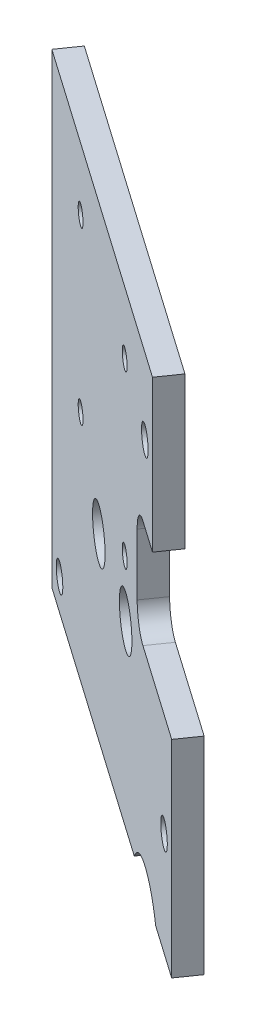
ISO-10303-21;
HEADER;
FILE_DESCRIPTION(('STEP AP214'),'2;1');
FILE_NAME('part.step','',(''),(''),'','','');
FILE_SCHEMA(('AUTOMOTIVE_DESIGN { 1 0 10303 214 1 1 1 1 }'));
ENDSEC;
DATA;
#1=APPLICATION_CONTEXT('core data for automotive mechanical design processes');
#2=APPLICATION_PROTOCOL_DEFINITION('international standard','automotive_design',2000,#1);
#3=PRODUCT_CONTEXT('',#1,'mechanical');
#4=PRODUCT('Part','Part','',(#3));
#5=PRODUCT_RELATED_PRODUCT_CATEGORY('part','',(#4));
#6=PRODUCT_DEFINITION_FORMATION('','',#4);
#7=PRODUCT_DEFINITION_CONTEXT('part definition',#1,'design');
#8=PRODUCT_DEFINITION('design','',#6,#7);
#9=PRODUCT_DEFINITION_SHAPE('','',#8);
#10=(LENGTH_UNIT() NAMED_UNIT(*) SI_UNIT(.MILLI.,.METRE.));
#11=(NAMED_UNIT(*) PLANE_ANGLE_UNIT() SI_UNIT($,.RADIAN.));
#12=(NAMED_UNIT(*) SI_UNIT($,.STERADIAN.) SOLID_ANGLE_UNIT());
#13=UNCERTAINTY_MEASURE_WITH_UNIT(LENGTH_MEASURE(1.E-05),#10,'distance_accuracy_value','');
#14=(GEOMETRIC_REPRESENTATION_CONTEXT(3) GLOBAL_UNCERTAINTY_ASSIGNED_CONTEXT((#13)) GLOBAL_UNIT_ASSIGNED_CONTEXT((#10,
#11,#12)) REPRESENTATION_CONTEXT('',''));
#15=CARTESIAN_POINT('',(0.,0.,0.));
#16=DIRECTION('',(0.,0.,1.));
#17=DIRECTION('',(1.,0.,0.));
#18=AXIS2_PLACEMENT_3D('',#15,#16,#17);
#19=CARTESIAN_POINT('',(1.01290984994584,263.511550751504,-34.4288985364269));
#20=DIRECTION('',(0.572880015701416,0.,-0.819639242356017));
#21=DIRECTION('',(-0.819639242356017,0.,-0.572880015701416));
#22=AXIS2_PLACEMENT_3D('',#19,#20,#21);
#23=PLANE('',#22);
#24=CARTESIAN_POINT('',(1.83254909230199,276.261550751504,-33.8560185207254));
#25=DIRECTION('',(0.572880015701416,0.,-0.819639242356017));
#26=DIRECTION('',(-0.819639242356017,0.,-0.572880015701416));
#27=AXIS2_PLACEMENT_3D('',#24,#25,#26);
#28=CIRCLE('',#27,3.46999999999997);
#29=CARTESIAN_POINT('',(-1.01159907867336,276.261550751504,-35.8439121752093));
#30=VERTEX_POINT('',#29);
#31=EDGE_CURVE('E317',#30,#30,#28,.T.);
#32=ORIENTED_EDGE('',*,*,#31,.F.);
#33=EDGE_LOOP('',(#32));
#34=FACE_BOUND('',#33,.T.);
#35=CARTESIAN_POINT('',(10.0405401142264,239.311550751504,-28.1191116200737));
#36=DIRECTION('',(0.572880015701416,0.,-0.819639242356017));
#37=DIRECTION('',(-0.819639242356017,0.,-0.572880015701416));
#38=AXIS2_PLACEMENT_3D('',#35,#36,#37);
#39=CIRCLE('',#38,3.47);
#40=CARTESIAN_POINT('',(7.19639194325104,239.311550751504,-30.1070052745576));
#41=VERTEX_POINT('',#40);
#42=EDGE_CURVE('E324',#41,#41,#39,.T.);
#43=ORIENTED_EDGE('',*,*,#42,.F.);
#44=EDGE_LOOP('',(#43));
#45=FACE_BOUND('',#44,.T.);
#46=CARTESIAN_POINT('',(-34.6413971925408,230.011550751504,-59.3491792194384));
#47=DIRECTION('',(0.572880015701416,0.,-0.819639242356017));
#48=DIRECTION('',(-0.819639242356017,0.,-0.572880015701416));
#49=AXIS2_PLACEMENT_3D('',#46,#47,#48);
#50=CIRCLE('',#49,3.47);
#51=CARTESIAN_POINT('',(-37.4855453635161,230.011550751504,-61.3370728739223));
#52=VERTEX_POINT('',#51);
#53=EDGE_CURVE('E333',#52,#52,#50,.T.);
#54=ORIENTED_EDGE('',*,*,#53,.F.);
#55=EDGE_LOOP('',(#54));
#56=FACE_BOUND('',#55,.T.);
#57=CARTESIAN_POINT('',(-25.6253655266247,278.011550751504,-53.0474990467229));
#58=DIRECTION('',(0.572880015701416,0.,-0.819639242356017));
#59=DIRECTION('',(-0.819639242356017,0.,-0.572880015701416));
#60=AXIS2_PLACEMENT_3D('',#57,#58,#59);
#61=CIRCLE('',#60,1.25);
#62=CARTESIAN_POINT('',(-26.6499145795698,278.011550751504,-53.7635990663497));
#63=VERTEX_POINT('',#62);
#64=EDGE_CURVE('E353',#63,#63,#61,.T.);
#65=ORIENTED_EDGE('',*,*,#64,.F.);
#66=EDGE_LOOP('',(#65));
#67=FACE_BOUND('',#66,.T.);
#68=CARTESIAN_POINT('',(-6.77366295243632,256.011550751504,-39.8712586855903));
#69=DIRECTION('',(0.572880015701416,0.,-0.819639242356017));
#70=DIRECTION('',(-0.819639242356017,0.,-0.572880015701416));
#71=AXIS2_PLACEMENT_3D('',#68,#69,#70);
#72=CIRCLE('',#71,1.25);
#73=CARTESIAN_POINT('',(-7.79821200538134,256.011550751504,-40.5873587052171));
#74=VERTEX_POINT('',#73);
#75=EDGE_CURVE('E346',#74,#74,#72,.T.);
#76=ORIENTED_EDGE('',*,*,#75,.F.);
#77=EDGE_LOOP('',(#76));
#78=FACE_BOUND('',#77,.T.);
#79=CARTESIAN_POINT('',(-25.6253655266247,256.011550751504,-53.0474990467229));
#80=DIRECTION('',(0.572880015701416,0.,-0.819639242356017));
#81=DIRECTION('',(-0.819639242356017,0.,-0.572880015701416));
#82=AXIS2_PLACEMENT_3D('',#79,#80,#81);
#83=CIRCLE('',#82,1.25);
#84=CARTESIAN_POINT('',(-26.6499145795698,256.011550751504,-53.7635990663497));
#85=VERTEX_POINT('',#84);
#86=EDGE_CURVE('E342',#85,#85,#83,.T.);
#87=ORIENTED_EDGE('',*,*,#86,.F.);
#88=EDGE_LOOP('',(#87));
#89=FACE_BOUND('',#88,.T.);
#90=CARTESIAN_POINT('',(-6.77366295243633,278.011550751504,-39.8712586855903));
#91=DIRECTION('',(0.572880015701416,0.,-0.819639242356017));
#92=DIRECTION('',(-0.819639242356017,0.,-0.572880015701416));
#93=AXIS2_PLACEMENT_3D('',#90,#91,#92);
#94=CIRCLE('',#93,1.25);
#95=CARTESIAN_POINT('',(-7.79821200538135,278.011550751504,-40.5873587052171));
#96=VERTEX_POINT('',#95);
#97=EDGE_CURVE('E352',#96,#96,#94,.T.);
#98=ORIENTED_EDGE('',*,*,#97,.F.);
#99=EDGE_LOOP('',(#98));
#100=FACE_BOUND('',#99,.T.);
#101=CARTESIAN_POINT('',(-6.36384333125833,249.061550751504,-39.5848186777396));
#102=DIRECTION('',(0.572880015701416,0.,-0.819639242356017));
#103=DIRECTION('',(-0.819639242356017,0.,-0.572880015701416));
#104=AXIS2_PLACEMENT_3D('',#101,#102,#103);
#105=CIRCLE('',#104,3.24999999999999);
#106=CARTESIAN_POINT('',(-9.02767086891538,249.061550751504,-41.4466787287692));
#107=VERTEX_POINT('',#106);
#108=EDGE_CURVE('E158',#107,#107,#105,.T.);
#109=ORIENTED_EDGE('',*,*,#108,.F.);
#110=EDGE_LOOP('',(#109));
#111=FACE_BOUND('',#110,.T.);
#112=DIRECTION('',(0.,-1.,0.));
#113=VECTOR('',#112,1.);
#114=CARTESIAN_POINT('',(5.11110606172592,286.011550751504,-31.5644984579198));
#115=LINE('',#114,#113);
#116=CARTESIAN_POINT('',(5.11110606172592,286.011550751504,-31.5644984579198));
#117=VERTEX_POINT('',#116);
#118=CARTESIAN_POINT('',(5.11110606172593,266.511550751504,-31.5644984579198));
#119=VERTEX_POINT('',#118);
#120=EDGE_CURVE('E177',#117,#119,#115,.T.);
#121=ORIENTED_EDGE('',*,*,#120,.T.);
#122=DIRECTION('',(-0.819639242356017,0.,-0.572880015701416));
#123=VECTOR('',#122,1.);
#124=CARTESIAN_POINT('',(5.11110606172593,266.511550751504,-31.5644984579198));
#125=LINE('',#124,#123);
#126=CARTESIAN_POINT('',(1.01290984994584,266.511550751504,-34.4288985364269));
#127=VERTEX_POINT('',#126);
#128=EDGE_CURVE('E105',#119,#127,#125,.T.);
#129=ORIENTED_EDGE('',*,*,#128,.T.);
#130=CARTESIAN_POINT('',(1.01290984994584,263.511550751504,-34.4288985364269));
#131=DIRECTION('',(-0.572880015701416,0.,0.819639242356017));
#132=DIRECTION('',(-0.819639242356017,0.,-0.572880015701416));
#133=AXIS2_PLACEMENT_3D('',#130,#131,#132);
#134=CIRCLE('',#133,3.);
#135=CARTESIAN_POINT('',(-1.4460078771222,263.511550751504,-36.1475385835311));
#136=VERTEX_POINT('',#135);
#137=EDGE_CURVE('E204',#127,#136,#134,.T.);
#138=ORIENTED_EDGE('',*,*,#137,.T.);
#139=DIRECTION('',(0.,-1.,0.));
#140=VECTOR('',#139,1.);
#141=CARTESIAN_POINT('',(-1.4460078771222,255.611550751504,-36.1475385835311));
#142=LINE('',#141,#140);
#143=CARTESIAN_POINT('',(-1.4460078771222,255.611550751504,-36.1475385835311));
#144=VERTEX_POINT('',#143);
#145=EDGE_CURVE('E223',#136,#144,#142,.T.);
#146=ORIENTED_EDGE('',*,*,#145,.T.);
#147=CARTESIAN_POINT('',(1.01290984994585,255.611550751504,-34.4288985364269));
#148=DIRECTION('',(-0.572880015701416,0.,0.819639242356017));
#149=DIRECTION('',(-0.819639242356017,0.,-0.572880015701416));
#150=AXIS2_PLACEMENT_3D('',#147,#148,#149);
#151=CIRCLE('',#150,3.);
#152=CARTESIAN_POINT('',(1.01290984994586,252.611550751504,-34.4288985364269));
#153=VERTEX_POINT('',#152);
#154=EDGE_CURVE('E220',#144,#153,#151,.T.);
#155=ORIENTED_EDGE('',*,*,#154,.T.);
#156=DIRECTION('',(0.819639242356017,0.,0.572880015701416));
#157=VECTOR('',#156,1.);
#158=CARTESIAN_POINT('',(13.3190970836504,252.611550751504,-25.8275915572681));
#159=LINE('',#158,#157);
#160=CARTESIAN_POINT('',(13.3190970836504,252.611550751504,-25.8275915572681));
#161=VERTEX_POINT('',#160);
#162=EDGE_CURVE('E222',#153,#161,#159,.T.);
#163=ORIENTED_EDGE('',*,*,#162,.T.);
#164=DIRECTION('',(0.,-1.,0.));
#165=VECTOR('',#164,1.);
#166=CARTESIAN_POINT('',(13.3190970836504,226.011550751504,-25.8275915572681));
#167=LINE('',#166,#165);
#168=CARTESIAN_POINT('',(13.3190970836504,226.011550751504,-25.8275915572681));
#169=VERTEX_POINT('',#168);
#170=EDGE_CURVE('E225',#161,#169,#167,.T.);
#171=ORIENTED_EDGE('',*,*,#170,.T.);
#172=DIRECTION('',(-0.819639242356017,0.,-0.572880015701416));
#173=VECTOR('',#172,1.);
#174=CARTESIAN_POINT('',(6.49000061143768,226.011550751504,-30.6007316072517));
#175=LINE('',#174,#173);
#176=CARTESIAN_POINT('',(6.49000061143768,226.011550751504,-30.6007316072517));
#177=VERTEX_POINT('',#176);
#178=EDGE_CURVE('E231',#169,#177,#175,.T.);
#179=ORIENTED_EDGE('',*,*,#178,.T.);
#180=CARTESIAN_POINT('',(1.90545868348782,221.802726425216,-33.8050589697609));
#181=DIRECTION('',(-0.572880015701416,0.,0.819639242356017));
#182=DIRECTION('',(-0.819639242356017,0.,-0.572880015701416));
#183=AXIS2_PLACEMENT_3D('',#180,#181,#182);
#184=CIRCLE('',#183,6.99999576748517);
#185=CARTESIAN_POINT('',(-2.67908324446203,226.011550751504,-37.0093863322701));
#186=VERTEX_POINT('',#185);
#187=EDGE_CURVE('E136',#177,#186,#184,.T.);
#188=ORIENTED_EDGE('',*,*,#187,.T.);
#189=DIRECTION('',(-0.819639242356017,0.,-0.572880015701416));
#190=VECTOR('',#189,1.);
#191=CARTESIAN_POINT('',(-2.67908324446203,226.011550751504,-37.0093863322701));
#192=LINE('',#191,#190);
#193=CARTESIAN_POINT('',(-37.9199541619649,226.011550751504,-61.6406992822442));
#194=VERTEX_POINT('',#193);
#195=EDGE_CURVE('E130',#186,#194,#192,.T.);
#196=ORIENTED_EDGE('',*,*,#195,.T.);
#197=DIRECTION('',(0.,1.,0.));
#198=VECTOR('',#197,1.);
#199=CARTESIAN_POINT('',(-37.919954161965,286.011550751504,-61.6406992822442));
#200=LINE('',#199,#198);
#201=CARTESIAN_POINT('',(-37.919954161965,286.011550751504,-61.6406992822442));
#202=VERTEX_POINT('',#201);
#203=EDGE_CURVE('E134',#194,#202,#200,.T.);
#204=ORIENTED_EDGE('',*,*,#203,.T.);
#205=DIRECTION('',(0.819639242356017,0.,0.572880015701416));
#206=VECTOR('',#205,1.);
#207=CARTESIAN_POINT('',(5.11110606172592,286.011550751504,-31.5644984579198));
#208=LINE('',#207,#206);
#209=EDGE_CURVE('E50',#202,#117,#208,.T.);
#210=ORIENTED_EDGE('',*,*,#209,.T.);
#211=EDGE_LOOP('',(#121,#129,#138,#146,#155,#163,#171,#179,#188,#196,#204,#210));
#212=FACE_BOUND('',#211,.T.);
#213=CARTESIAN_POINT('',(-17.8387927242426,249.061550751504,-47.6051388975595));
#214=DIRECTION('',(0.572880015701416,0.,-0.819639242356017));
#215=DIRECTION('',(-0.819639242356017,0.,-0.572880015701416));
#216=AXIS2_PLACEMENT_3D('',#213,#214,#215);
#217=CIRCLE('',#216,3.25000000000001);
#218=CARTESIAN_POINT('',(-20.5026202618996,249.061550751504,-49.4669989485891));
#219=VERTEX_POINT('',#218);
#220=EDGE_CURVE('E367',#219,#219,#217,.T.);
#221=ORIENTED_EDGE('',*,*,#220,.F.);
#222=EDGE_LOOP('',(#221));
#223=FACE_BOUND('',#222,.T.);
#224=ADVANCED_FACE('F33',(#34,#45,#56,#67,#78,#89,#100,#111,#212,#223),#23,.T.);
#225=CARTESIAN_POINT('',(-0.705730197158404,263.511550751504,-31.9699808093588));
#226=DIRECTION('',(0.572880015701416,0.,-0.819639242356017));
#227=DIRECTION('',(-0.819639242356017,0.,-0.572880015701416));
#228=AXIS2_PLACEMENT_3D('',#225,#226,#227);
#229=PLANE('',#228);
#230=CARTESIAN_POINT('',(0.11390904519774,276.261550751504,-31.3971007936573));
#231=DIRECTION('',(0.572880015701416,0.,-0.819639242356017));
#232=DIRECTION('',(-0.819639242356017,0.,-0.572880015701416));
#233=AXIS2_PLACEMENT_3D('',#230,#231,#232);
#234=CIRCLE('',#233,1.69999999999998);
#235=CARTESIAN_POINT('',(-1.27947766680747,276.261550751504,-32.3709968203497));
#236=VERTEX_POINT('',#235);
#237=EDGE_CURVE('E319',#236,#236,#234,.T.);
#238=ORIENTED_EDGE('',*,*,#237,.T.);
#239=EDGE_LOOP('',(#238));
#240=FACE_BOUND('',#239,.T.);
#241=CARTESIAN_POINT('',(8.32190006712217,239.311550751504,-25.6601938930057));
#242=DIRECTION('',(0.572880015701416,0.,-0.819639242356017));
#243=DIRECTION('',(-0.819639242356017,0.,-0.572880015701416));
#244=AXIS2_PLACEMENT_3D('',#241,#242,#243);
#245=CIRCLE('',#244,1.69999999999998);
#246=CARTESIAN_POINT('',(6.92851335511696,239.311550751504,-26.6340899196981));
#247=VERTEX_POINT('',#246);
#248=EDGE_CURVE('E330',#247,#247,#245,.T.);
#249=ORIENTED_EDGE('',*,*,#248,.T.);
#250=EDGE_LOOP('',(#249));
#251=FACE_BOUND('',#250,.T.);
#252=CARTESIAN_POINT('',(-36.360037239645,230.011550751504,-56.8902614923704));
#253=DIRECTION('',(0.572880015701416,0.,-0.819639242356017));
#254=DIRECTION('',(-0.819639242356017,0.,-0.572880015701416));
#255=AXIS2_PLACEMENT_3D('',#252,#253,#254);
#256=CIRCLE('',#255,1.69999999999998);
#257=CARTESIAN_POINT('',(-37.7534239516502,230.011550751504,-57.8641575190628));
#258=VERTEX_POINT('',#257);
#259=EDGE_CURVE('E339',#258,#258,#256,.T.);
#260=ORIENTED_EDGE('',*,*,#259,.T.);
#261=EDGE_LOOP('',(#260));
#262=FACE_BOUND('',#261,.T.);
#263=CARTESIAN_POINT('',(-27.344005573729,278.011550751504,-50.5885813196549));
#264=DIRECTION('',(0.572880015701416,0.,-0.819639242356017));
#265=DIRECTION('',(-0.819639242356017,0.,-0.572880015701416));
#266=AXIS2_PLACEMENT_3D('',#263,#264,#265);
#267=CIRCLE('',#266,1.25);
#268=CARTESIAN_POINT('',(-28.368554626674,278.011550751504,-51.3046813392817));
#269=VERTEX_POINT('',#268);
#270=EDGE_CURVE('E349',#269,#269,#267,.T.);
#271=ORIENTED_EDGE('',*,*,#270,.T.);
#272=EDGE_LOOP('',(#271));
#273=FACE_BOUND('',#272,.T.);
#274=CARTESIAN_POINT('',(-8.49230299954056,256.011550751504,-37.4123409585223));
#275=DIRECTION('',(0.572880015701416,0.,-0.819639242356017));
#276=DIRECTION('',(-0.819639242356017,0.,-0.572880015701416));
#277=AXIS2_PLACEMENT_3D('',#274,#275,#276);
#278=CIRCLE('',#277,1.25);
#279=CARTESIAN_POINT('',(-9.51685205248559,256.011550751504,-38.1284409781491));
#280=VERTEX_POINT('',#279);
#281=EDGE_CURVE('E356',#280,#280,#278,.T.);
#282=ORIENTED_EDGE('',*,*,#281,.T.);
#283=EDGE_LOOP('',(#282));
#284=FACE_BOUND('',#283,.T.);
#285=CARTESIAN_POINT('',(-27.344005573729,256.011550751504,-50.5885813196549));
#286=DIRECTION('',(0.572880015701416,0.,-0.819639242356017));
#287=DIRECTION('',(-0.819639242356017,0.,-0.572880015701416));
#288=AXIS2_PLACEMENT_3D('',#285,#286,#287);
#289=CIRCLE('',#288,1.25);
#290=CARTESIAN_POINT('',(-28.368554626674,256.011550751504,-51.3046813392817));
#291=VERTEX_POINT('',#290);
#292=EDGE_CURVE('E343',#291,#291,#289,.T.);
#293=ORIENTED_EDGE('',*,*,#292,.T.);
#294=EDGE_LOOP('',(#293));
#295=FACE_BOUND('',#294,.T.);
#296=CARTESIAN_POINT('',(-8.49230299954058,278.011550751504,-37.4123409585223));
#297=DIRECTION('',(0.572880015701416,0.,-0.819639242356017));
#298=DIRECTION('',(-0.819639242356017,0.,-0.572880015701416));
#299=AXIS2_PLACEMENT_3D('',#296,#297,#298);
#300=CIRCLE('',#299,1.25);
#301=CARTESIAN_POINT('',(-9.5168520524856,278.011550751504,-38.1284409781491));
#302=VERTEX_POINT('',#301);
#303=EDGE_CURVE('E361',#302,#302,#300,.T.);
#304=ORIENTED_EDGE('',*,*,#303,.T.);
#305=EDGE_LOOP('',(#304));
#306=FACE_BOUND('',#305,.T.);
#307=DIRECTION('',(0.,-1.,0.));
#308=VECTOR('',#307,1.);
#309=CARTESIAN_POINT('',(3.39246601462168,286.011550751504,-29.1055807308518));
#310=LINE('',#309,#308);
#311=CARTESIAN_POINT('',(3.39246601462168,286.011550751504,-29.1055807308518));
#312=VERTEX_POINT('',#311);
#313=CARTESIAN_POINT('',(3.39246601462168,266.511550751504,-29.1055807308518));
#314=VERTEX_POINT('',#313);
#315=EDGE_CURVE('E154',#312,#314,#310,.T.);
#316=ORIENTED_EDGE('',*,*,#315,.F.);
#317=DIRECTION('',(0.819639242356017,0.,0.572880015701416));
#318=VECTOR('',#317,1.);
#319=CARTESIAN_POINT('',(3.39246601462168,286.011550751504,-29.1055807308518));
#320=LINE('',#319,#318);
#321=CARTESIAN_POINT('',(-39.6385942090692,286.011550751504,-59.1817815551761));
#322=VERTEX_POINT('',#321);
#323=EDGE_CURVE('E97',#322,#312,#320,.T.);
#324=ORIENTED_EDGE('',*,*,#323,.F.);
#325=DIRECTION('',(0.,1.,0.));
#326=VECTOR('',#325,1.);
#327=CARTESIAN_POINT('',(-39.6385942090692,286.011550751504,-59.1817815551761));
#328=LINE('',#327,#326);
#329=CARTESIAN_POINT('',(-39.6385942090692,226.011550751504,-59.1817815551761));
#330=VERTEX_POINT('',#329);
#331=EDGE_CURVE('E91',#330,#322,#328,.T.);
#332=ORIENTED_EDGE('',*,*,#331,.F.);
#333=DIRECTION('',(-0.819639242356017,0.,-0.572880015701416));
#334=VECTOR('',#333,1.);
#335=CARTESIAN_POINT('',(-4.39772329156628,226.011550751504,-34.5504686052021));
#336=LINE('',#335,#334);
#337=CARTESIAN_POINT('',(-4.39772329156628,226.011550751504,-34.5504686052021));
#338=VERTEX_POINT('',#337);
#339=EDGE_CURVE('E144',#338,#330,#336,.T.);
#340=ORIENTED_EDGE('',*,*,#339,.F.);
#341=CARTESIAN_POINT('',(0.186818636383576,221.802726425216,-31.3461412426929));
#342=DIRECTION('',(-0.572880015701416,0.,0.819639242356017));
#343=DIRECTION('',(-0.819639242356017,0.,-0.572880015701416));
#344=AXIS2_PLACEMENT_3D('',#341,#342,#343);
#345=CIRCLE('',#344,6.99999576748517);
#346=CARTESIAN_POINT('',(4.77136056433343,226.011550751504,-28.1418138801837));
#347=VERTEX_POINT('',#346);
#348=EDGE_CURVE('E172',#347,#338,#345,.T.);
#349=ORIENTED_EDGE('',*,*,#348,.F.);
#350=DIRECTION('',(-0.819639242356017,0.,-0.572880015701416));
#351=VECTOR('',#350,1.);
#352=CARTESIAN_POINT('',(4.77136056433343,226.011550751504,-28.1418138801837));
#353=LINE('',#352,#351);
#354=CARTESIAN_POINT('',(11.6004570365461,226.011550751504,-23.3686738302001));
#355=VERTEX_POINT('',#354);
#356=EDGE_CURVE('E170',#355,#347,#353,.T.);
#357=ORIENTED_EDGE('',*,*,#356,.F.);
#358=DIRECTION('',(0.,-1.,0.));
#359=VECTOR('',#358,1.);
#360=CARTESIAN_POINT('',(11.6004570365461,226.011550751504,-23.3686738302001));
#361=LINE('',#360,#359);
#362=CARTESIAN_POINT('',(11.6004570365461,252.611550751504,-23.3686738302001));
#363=VERTEX_POINT('',#362);
#364=EDGE_CURVE('E168',#363,#355,#361,.T.);
#365=ORIENTED_EDGE('',*,*,#364,.F.);
#366=DIRECTION('',(0.819639242356017,0.,0.572880015701416));
#367=VECTOR('',#366,1.);
#368=CARTESIAN_POINT('',(11.6004570365461,252.611550751504,-23.3686738302001));
#369=LINE('',#368,#367);
#370=CARTESIAN_POINT('',(-0.705730197158392,252.611550751504,-31.9699808093588));
#371=VERTEX_POINT('',#370);
#372=EDGE_CURVE('E166',#371,#363,#369,.T.);
#373=ORIENTED_EDGE('',*,*,#372,.F.);
#374=CARTESIAN_POINT('',(-0.705730197158394,255.611550751504,-31.9699808093588));
#375=DIRECTION('',(-0.572880015701416,0.,0.819639242356017));
#376=DIRECTION('',(-0.819639242356017,0.,-0.572880015701416));
#377=AXIS2_PLACEMENT_3D('',#374,#375,#376);
#378=CIRCLE('',#377,3.);
#379=CARTESIAN_POINT('',(-3.16464792422645,255.611550751504,-33.6886208564631));
#380=VERTEX_POINT('',#379);
#381=EDGE_CURVE('E164',#380,#371,#378,.T.);
#382=ORIENTED_EDGE('',*,*,#381,.F.);
#383=DIRECTION('',(0.,-1.,0.));
#384=VECTOR('',#383,1.);
#385=CARTESIAN_POINT('',(-3.16464792422645,255.611550751504,-33.6886208564631));
#386=LINE('',#385,#384);
#387=CARTESIAN_POINT('',(-3.16464792422645,263.511550751504,-33.6886208564631));
#388=VERTEX_POINT('',#387);
#389=EDGE_CURVE('E162',#388,#380,#386,.T.);
#390=ORIENTED_EDGE('',*,*,#389,.F.);
#391=CARTESIAN_POINT('',(-0.705730197158404,263.511550751504,-31.9699808093588));
#392=DIRECTION('',(-0.572880015701416,0.,0.819639242356017));
#393=DIRECTION('',(-0.819639242356017,0.,-0.572880015701416));
#394=AXIS2_PLACEMENT_3D('',#391,#392,#393);
#395=CIRCLE('',#394,3.);
#396=CARTESIAN_POINT('',(-0.705730197158406,266.511550751504,-31.9699808093588));
#397=VERTEX_POINT('',#396);
#398=EDGE_CURVE('E160',#397,#388,#395,.T.);
#399=ORIENTED_EDGE('',*,*,#398,.F.);
#400=DIRECTION('',(-0.819639242356017,0.,-0.572880015701416));
#401=VECTOR('',#400,1.);
#402=CARTESIAN_POINT('',(3.39246601462168,266.511550751504,-29.1055807308518));
#403=LINE('',#402,#401);
#404=EDGE_CURVE('E157',#314,#397,#403,.T.);
#405=ORIENTED_EDGE('',*,*,#404,.F.);
#406=EDGE_LOOP('',(#316,#324,#332,#340,#349,#357,#365,#373,#382,#390,#399,#405));
#407=FACE_BOUND('',#406,.T.);
#408=CARTESIAN_POINT('',(-8.08248337836257,249.061550751504,-37.1259009506716));
#409=DIRECTION('',(0.572880015701416,0.,-0.819639242356017));
#410=DIRECTION('',(-0.819639242356017,0.,-0.572880015701416));
#411=AXIS2_PLACEMENT_3D('',#408,#409,#410);
#412=CIRCLE('',#411,3.24999999999999);
#413=CARTESIAN_POINT('',(-10.7463109160196,249.061550751504,-38.9877610017012));
#414=VERTEX_POINT('',#413);
#415=EDGE_CURVE('E370',#414,#414,#412,.T.);
#416=ORIENTED_EDGE('',*,*,#415,.T.);
#417=EDGE_LOOP('',(#416));
#418=FACE_BOUND('',#417,.T.);
#419=CARTESIAN_POINT('',(-19.5574327713468,249.061550751504,-45.1462211704914));
#420=DIRECTION('',(0.572880015701416,0.,-0.819639242356017));
#421=DIRECTION('',(-0.819639242356017,0.,-0.572880015701416));
#422=AXIS2_PLACEMENT_3D('',#419,#420,#421);
#423=CIRCLE('',#422,3.25000000000001);
#424=CARTESIAN_POINT('',(-22.2212603090039,249.061550751504,-47.008081221521));
#425=VERTEX_POINT('',#424);
#426=EDGE_CURVE('E364',#425,#425,#423,.T.);
#427=ORIENTED_EDGE('',*,*,#426,.T.);
#428=EDGE_LOOP('',(#427));
#429=FACE_BOUND('',#428,.T.);
#430=ADVANCED_FACE('F208',(#240,#251,#262,#273,#284,#295,#306,#407,#418,#429),#229,.F.);
#431=CARTESIAN_POINT('',(5.11110606172592,286.011550751504,-31.5644984579198));
#432=DIRECTION('',(-0.819639242356017,0.,-0.572880015701416));
#433=DIRECTION('',(-0.572880015701416,0.,0.819639242356017));
#434=AXIS2_PLACEMENT_3D('',#431,#432,#433);
#435=PLANE('',#434);
#436=ORIENTED_EDGE('',*,*,#315,.T.);
#437=DIRECTION('',(-0.572880015701416,0.,0.819639242356017));
#438=VECTOR('',#437,1.);
#439=CARTESIAN_POINT('',(5.11110606172593,266.511550751504,-31.5644984579198));
#440=LINE('',#439,#438);
#441=EDGE_CURVE('E11',#119,#314,#440,.T.);
#442=ORIENTED_EDGE('',*,*,#441,.F.);
#443=ORIENTED_EDGE('',*,*,#120,.F.);
#444=DIRECTION('',(-0.572880015701416,0.,0.819639242356017));
#445=VECTOR('',#444,1.);
#446=CARTESIAN_POINT('',(5.11110606172592,286.011550751504,-31.5644984579198));
#447=LINE('',#446,#445);
#448=EDGE_CURVE('E150',#117,#312,#447,.T.);
#449=ORIENTED_EDGE('',*,*,#448,.T.);
#450=EDGE_LOOP('',(#436,#442,#443,#449));
#451=FACE_BOUND('',#450,.T.);
#452=ADVANCED_FACE('F35',(#451),#435,.F.);
#453=CARTESIAN_POINT('',(5.11110606172593,266.511550751504,-31.5644984579198));
#454=DIRECTION('',(0.,1.,0.));
#455=DIRECTION('',(0.,0.,1.));
#456=AXIS2_PLACEMENT_3D('',#453,#454,#455);
#457=PLANE('',#456);
#458=ORIENTED_EDGE('',*,*,#404,.T.);
#459=DIRECTION('',(-0.572880015701416,0.,0.819639242356017));
#460=VECTOR('',#459,1.);
#461=CARTESIAN_POINT('',(1.01290984994584,266.511550751504,-34.4288985364269));
#462=LINE('',#461,#460);
#463=EDGE_CURVE('E42',#127,#397,#462,.T.);
#464=ORIENTED_EDGE('',*,*,#463,.F.);
#465=ORIENTED_EDGE('',*,*,#128,.F.);
#466=ORIENTED_EDGE('',*,*,#441,.T.);
#467=EDGE_LOOP('',(#458,#464,#465,#466));
#468=FACE_BOUND('',#467,.T.);
#469=ADVANCED_FACE('F545',(#468),#457,.F.);
#470=CARTESIAN_POINT('',(1.01290984994584,263.511550751504,-34.4288985364269));
#471=DIRECTION('',(-0.572880015701416,0.,0.819639242356017));
#472=DIRECTION('',(0.819639242356017,0.,0.572880015701416));
#473=AXIS2_PLACEMENT_3D('',#470,#471,#472);
#474=CYLINDRICAL_SURFACE('',#473,3.);
#475=ORIENTED_EDGE('',*,*,#398,.T.);
#476=DIRECTION('',(-0.572880015701416,0.,0.819639242356017));
#477=VECTOR('',#476,1.);
#478=CARTESIAN_POINT('',(-1.4460078771222,263.511550751504,-36.1475385835311));
#479=LINE('',#478,#477);
#480=EDGE_CURVE('E196',#136,#388,#479,.T.);
#481=ORIENTED_EDGE('',*,*,#480,.F.);
#482=ORIENTED_EDGE('',*,*,#137,.F.);
#483=ORIENTED_EDGE('',*,*,#463,.T.);
#484=EDGE_LOOP('',(#475,#481,#482,#483));
#485=FACE_BOUND('',#484,.T.);
#486=ADVANCED_FACE('F202',(#485),#474,.F.);
#487=CARTESIAN_POINT('',(-1.4460078771222,255.611550751504,-36.1475385835311));
#488=DIRECTION('',(-0.819639242356017,0.,-0.572880015701416));
#489=DIRECTION('',(-0.572880015701416,0.,0.819639242356017));
#490=AXIS2_PLACEMENT_3D('',#487,#488,#489);
#491=PLANE('',#490);
#492=ORIENTED_EDGE('',*,*,#389,.T.);
#493=DIRECTION('',(-0.572880015701416,0.,0.819639242356017));
#494=VECTOR('',#493,1.);
#495=CARTESIAN_POINT('',(-1.4460078771222,255.611550751504,-36.1475385835311));
#496=LINE('',#495,#494);
#497=EDGE_CURVE('E193',#144,#380,#496,.T.);
#498=ORIENTED_EDGE('',*,*,#497,.F.);
#499=ORIENTED_EDGE('',*,*,#145,.F.);
#500=ORIENTED_EDGE('',*,*,#480,.T.);
#501=EDGE_LOOP('',(#492,#498,#499,#500));
#502=FACE_BOUND('',#501,.T.);
#503=ADVANCED_FACE('F214',(#502),#491,.F.);
#504=CARTESIAN_POINT('',(1.01290984994585,255.611550751504,-34.4288985364269));
#505=DIRECTION('',(-0.572880015701416,0.,0.819639242356017));
#506=DIRECTION('',(0.819639242356017,0.,0.572880015701416));
#507=AXIS2_PLACEMENT_3D('',#504,#505,#506);
#508=CYLINDRICAL_SURFACE('',#507,3.);
#509=ORIENTED_EDGE('',*,*,#381,.T.);
#510=DIRECTION('',(-0.572880015701416,0.,0.819639242356017));
#511=VECTOR('',#510,1.);
#512=CARTESIAN_POINT('',(1.01290984994586,252.611550751504,-34.4288985364269));
#513=LINE('',#512,#511);
#514=EDGE_CURVE('E190',#153,#371,#513,.T.);
#515=ORIENTED_EDGE('',*,*,#514,.F.);
#516=ORIENTED_EDGE('',*,*,#154,.F.);
#517=ORIENTED_EDGE('',*,*,#497,.T.);
#518=EDGE_LOOP('',(#509,#515,#516,#517));
#519=FACE_BOUND('',#518,.T.);
#520=ADVANCED_FACE('F218',(#519),#508,.F.);
#521=CARTESIAN_POINT('',(13.3190970836504,252.611550751504,-25.8275915572681));
#522=DIRECTION('',(0.,-1.,0.));
#523=DIRECTION('',(0.,0.,-1.));
#524=AXIS2_PLACEMENT_3D('',#521,#522,#523);
#525=PLANE('',#524);
#526=ORIENTED_EDGE('',*,*,#372,.T.);
#527=DIRECTION('',(-0.572880015701416,0.,0.819639242356017));
#528=VECTOR('',#527,1.);
#529=CARTESIAN_POINT('',(13.3190970836504,252.611550751504,-25.8275915572681));
#530=LINE('',#529,#528);
#531=EDGE_CURVE('E187',#161,#363,#530,.T.);
#532=ORIENTED_EDGE('',*,*,#531,.F.);
#533=ORIENTED_EDGE('',*,*,#162,.F.);
#534=ORIENTED_EDGE('',*,*,#514,.T.);
#535=EDGE_LOOP('',(#526,#532,#533,#534));
#536=FACE_BOUND('',#535,.T.);
#537=ADVANCED_FACE('F510',(#536),#525,.F.);
#538=CARTESIAN_POINT('',(13.3190970836504,226.011550751504,-25.8275915572681));
#539=DIRECTION('',(-0.819639242356017,0.,-0.572880015701416));
#540=DIRECTION('',(-0.572880015701416,0.,0.819639242356017));
#541=AXIS2_PLACEMENT_3D('',#538,#539,#540);
#542=PLANE('',#541);
#543=ORIENTED_EDGE('',*,*,#364,.T.);
#544=DIRECTION('',(-0.572880015701416,0.,0.819639242356017));
#545=VECTOR('',#544,1.);
#546=CARTESIAN_POINT('',(13.3190970836504,226.011550751504,-25.8275915572681));
#547=LINE('',#546,#545);
#548=EDGE_CURVE('E184',#169,#355,#547,.T.);
#549=ORIENTED_EDGE('',*,*,#548,.F.);
#550=ORIENTED_EDGE('',*,*,#170,.F.);
#551=ORIENTED_EDGE('',*,*,#531,.T.);
#552=EDGE_LOOP('',(#543,#549,#550,#551));
#553=FACE_BOUND('',#552,.T.);
#554=ADVANCED_FACE('F501',(#553),#542,.F.);
#555=CARTESIAN_POINT('',(6.49000061143768,226.011550751504,-30.6007316072517));
#556=DIRECTION('',(0.,1.,0.));
#557=DIRECTION('',(0.,0.,1.));
#558=AXIS2_PLACEMENT_3D('',#555,#556,#557);
#559=PLANE('',#558);
#560=ORIENTED_EDGE('',*,*,#356,.T.);
#561=DIRECTION('',(-0.572880015701416,0.,0.819639242356017));
#562=VECTOR('',#561,1.);
#563=CARTESIAN_POINT('',(6.49000061143768,226.011550751504,-30.6007316072517));
#564=LINE('',#563,#562);
#565=EDGE_CURVE('E181',#177,#347,#564,.T.);
#566=ORIENTED_EDGE('',*,*,#565,.F.);
#567=ORIENTED_EDGE('',*,*,#178,.F.);
#568=ORIENTED_EDGE('',*,*,#548,.T.);
#569=EDGE_LOOP('',(#560,#566,#567,#568));
#570=FACE_BOUND('',#569,.T.);
#571=ADVANCED_FACE('F237',(#570),#559,.F.);
#572=CARTESIAN_POINT('',(1.90545868348782,221.802726425216,-33.8050589697609));
#573=DIRECTION('',(-0.572880015701416,0.,0.819639242356017));
#574=DIRECTION('',(0.819639242356017,0.,0.572880015701416));
#575=AXIS2_PLACEMENT_3D('',#572,#573,#574);
#576=CYLINDRICAL_SURFACE('',#575,6.99999576748517);
#577=ORIENTED_EDGE('',*,*,#348,.T.);
#578=DIRECTION('',(-0.572880015701416,0.,0.819639242356017));
#579=VECTOR('',#578,1.);
#580=CARTESIAN_POINT('',(-2.67908324446203,226.011550751504,-37.0093863322701));
#581=LINE('',#580,#579);
#582=EDGE_CURVE('E145',#186,#338,#581,.T.);
#583=ORIENTED_EDGE('',*,*,#582,.F.);
#584=ORIENTED_EDGE('',*,*,#187,.F.);
#585=ORIENTED_EDGE('',*,*,#565,.T.);
#586=EDGE_LOOP('',(#577,#583,#584,#585));
#587=FACE_BOUND('',#586,.T.);
#588=ADVANCED_FACE('F241',(#587),#576,.F.);
#589=CARTESIAN_POINT('',(-2.67908324446203,226.011550751504,-37.0093863322701));
#590=DIRECTION('',(0.,1.,0.));
#591=DIRECTION('',(-1.,0.,0.));
#592=AXIS2_PLACEMENT_3D('',#589,#590,#591);
#593=PLANE('',#592);
#594=ORIENTED_EDGE('',*,*,#339,.T.);
#595=DIRECTION('',(-0.572880015701416,0.,0.819639242356017));
#596=VECTOR('',#595,1.);
#597=CARTESIAN_POINT('',(-37.9199541619649,226.011550751504,-61.6406992822442));
#598=LINE('',#597,#596);
#599=EDGE_CURVE('E141',#194,#330,#598,.T.);
#600=ORIENTED_EDGE('',*,*,#599,.F.);
#601=ORIENTED_EDGE('',*,*,#195,.F.);
#602=ORIENTED_EDGE('',*,*,#582,.T.);
#603=EDGE_LOOP('',(#594,#600,#601,#602));
#604=FACE_BOUND('',#603,.T.);
#605=ADVANCED_FACE('F142',(#604),#593,.F.);
#606=CARTESIAN_POINT('',(-37.919954161965,286.011550751504,-61.6406992822442));
#607=DIRECTION('',(0.819639242356017,0.,0.572880015701416));
#608=DIRECTION('',(0.572880015701416,0.,-0.819639242356017));
#609=AXIS2_PLACEMENT_3D('',#606,#607,#608);
#610=PLANE('',#609);
#611=ORIENTED_EDGE('',*,*,#331,.T.);
#612=DIRECTION('',(-0.572880015701416,0.,0.819639242356017));
#613=VECTOR('',#612,1.);
#614=CARTESIAN_POINT('',(-37.919954161965,286.011550751504,-61.6406992822442));
#615=LINE('',#614,#613);
#616=EDGE_CURVE('E146',#202,#322,#615,.T.);
#617=ORIENTED_EDGE('',*,*,#616,.F.);
#618=ORIENTED_EDGE('',*,*,#203,.F.);
#619=ORIENTED_EDGE('',*,*,#599,.T.);
#620=EDGE_LOOP('',(#611,#617,#618,#619));
#621=FACE_BOUND('',#620,.T.);
#622=ADVANCED_FACE('F148',(#621),#610,.F.);
#623=CARTESIAN_POINT('',(5.11110606172592,286.011550751504,-31.5644984579198));
#624=DIRECTION('',(0.,-1.,0.));
#625=DIRECTION('',(1.,0.,0.));
#626=AXIS2_PLACEMENT_3D('',#623,#624,#625);
#627=PLANE('',#626);
#628=ORIENTED_EDGE('',*,*,#323,.T.);
#629=ORIENTED_EDGE('',*,*,#448,.F.);
#630=ORIENTED_EDGE('',*,*,#209,.F.);
#631=ORIENTED_EDGE('',*,*,#616,.T.);
#632=EDGE_LOOP('',(#628,#629,#630,#631));
#633=FACE_BOUND('',#632,.T.);
#634=ADVANCED_FACE('F245',(#633),#627,.F.);
#635=CARTESIAN_POINT('',(-6.36384333125833,249.061550751504,-39.5848186777396));
#636=DIRECTION('',(-0.572880015701416,0.,0.819639242356017));
#637=DIRECTION('',(0.819639242356017,0.,0.572880015701416));
#638=AXIS2_PLACEMENT_3D('',#635,#636,#637);
#639=CYLINDRICAL_SURFACE('',#638,3.24999999999999);
#640=ORIENTED_EDGE('',*,*,#108,.T.);
#641=EDGE_LOOP('',(#640));
#642=FACE_BOUND('',#641,.T.);
#643=ORIENTED_EDGE('',*,*,#415,.F.);
#644=EDGE_LOOP('',(#643));
#645=FACE_BOUND('',#644,.T.);
#646=ADVANCED_FACE('F247',(#642,#645),#639,.F.);
#647=CARTESIAN_POINT('',(-17.8387927242426,249.061550751504,-47.6051388975595));
#648=DIRECTION('',(-0.572880015701416,0.,0.819639242356017));
#649=DIRECTION('',(0.819639242356017,0.,0.572880015701416));
#650=AXIS2_PLACEMENT_3D('',#647,#648,#649);
#651=CYLINDRICAL_SURFACE('',#650,3.25000000000001);
#652=ORIENTED_EDGE('',*,*,#220,.T.);
#653=EDGE_LOOP('',(#652));
#654=FACE_BOUND('',#653,.T.);
#655=ORIENTED_EDGE('',*,*,#426,.F.);
#656=EDGE_LOOP('',(#655));
#657=FACE_BOUND('',#656,.T.);
#658=ADVANCED_FACE('F253',(#654,#657),#651,.F.);
#659=CARTESIAN_POINT('',(-8.49230299954058,278.011550751504,-37.4123409585223));
#660=DIRECTION('',(0.572880015701416,0.,-0.819639242356017));
#661=DIRECTION('',(-0.819639242356017,0.,-0.572880015701416));
#662=AXIS2_PLACEMENT_3D('',#659,#660,#661);
#663=CYLINDRICAL_SURFACE('',#662,1.25);
#664=ORIENTED_EDGE('',*,*,#303,.F.);
#665=EDGE_LOOP('',(#664));
#666=FACE_BOUND('',#665,.T.);
#667=ORIENTED_EDGE('',*,*,#97,.T.);
#668=EDGE_LOOP('',(#667));
#669=FACE_BOUND('',#668,.T.);
#670=ADVANCED_FACE('F270',(#666,#669),#663,.F.);
#671=CARTESIAN_POINT('',(-27.344005573729,256.011550751504,-50.5885813196549));
#672=DIRECTION('',(0.572880015701416,0.,-0.819639242356017));
#673=DIRECTION('',(-0.819639242356017,0.,-0.572880015701416));
#674=AXIS2_PLACEMENT_3D('',#671,#672,#673);
#675=CYLINDRICAL_SURFACE('',#674,1.25);
#676=ORIENTED_EDGE('',*,*,#292,.F.);
#677=EDGE_LOOP('',(#676));
#678=FACE_BOUND('',#677,.T.);
#679=ORIENTED_EDGE('',*,*,#86,.T.);
#680=EDGE_LOOP('',(#679));
#681=FACE_BOUND('',#680,.T.);
#682=ADVANCED_FACE('F274',(#678,#681),#675,.F.);
#683=CARTESIAN_POINT('',(-8.49230299954056,256.011550751504,-37.4123409585223));
#684=DIRECTION('',(0.572880015701416,0.,-0.819639242356017));
#685=DIRECTION('',(-0.819639242356017,0.,-0.572880015701416));
#686=AXIS2_PLACEMENT_3D('',#683,#684,#685);
#687=CYLINDRICAL_SURFACE('',#686,1.25);
#688=ORIENTED_EDGE('',*,*,#281,.F.);
#689=EDGE_LOOP('',(#688));
#690=FACE_BOUND('',#689,.T.);
#691=ORIENTED_EDGE('',*,*,#75,.T.);
#692=EDGE_LOOP('',(#691));
#693=FACE_BOUND('',#692,.T.);
#694=ADVANCED_FACE('F276',(#690,#693),#687,.F.);
#695=CARTESIAN_POINT('',(-27.344005573729,278.011550751504,-50.5885813196549));
#696=DIRECTION('',(0.572880015701416,0.,-0.819639242356017));
#697=DIRECTION('',(-0.819639242356017,0.,-0.572880015701416));
#698=AXIS2_PLACEMENT_3D('',#695,#696,#697);
#699=CYLINDRICAL_SURFACE('',#698,1.25);
#700=ORIENTED_EDGE('',*,*,#270,.F.);
#701=EDGE_LOOP('',(#700));
#702=FACE_BOUND('',#701,.T.);
#703=ORIENTED_EDGE('',*,*,#64,.T.);
#704=EDGE_LOOP('',(#703));
#705=FACE_BOUND('',#704,.T.);
#706=ADVANCED_FACE('F279',(#702,#705),#699,.F.);
#707=CARTESIAN_POINT('',(-34.6413971925408,230.011550751504,-59.3491792194384));
#708=DIRECTION('',(0.572880015701416,0.,-0.819639242356017));
#709=DIRECTION('',(-0.819639242356017,0.,-0.572880015701416));
#710=AXIS2_PLACEMENT_3D('',#707,#708,#709);
#711=CYLINDRICAL_SURFACE('',#710,1.69999999999999);
#712=ORIENTED_EDGE('',*,*,#259,.F.);
#713=EDGE_LOOP('',(#712));
#714=FACE_BOUND('',#713,.T.);
#715=CARTESIAN_POINT('',(-35.6553948203323,230.011550751504,-57.8984177604683));
#716=DIRECTION('',(0.572880015701416,0.,-0.819639242356017));
#717=DIRECTION('',(-0.819639242356017,0.,-0.572880015701416));
#718=AXIS2_PLACEMENT_3D('',#715,#716,#717);
#719=CIRCLE('',#718,1.70000000000001);
#720=CARTESIAN_POINT('',(-37.0487815323375,230.011550751504,-58.8723137871607));
#721=VERTEX_POINT('',#720);
#722=EDGE_CURVE('E336',#721,#721,#719,.T.);
#723=ORIENTED_EDGE('',*,*,#722,.T.);
#724=EDGE_LOOP('',(#723));
#725=FACE_BOUND('',#724,.T.);
#726=ADVANCED_FACE('F283',(#714,#725),#711,.F.);
#727=CARTESIAN_POINT('',(-34.6413971925408,230.011550751504,-59.3491792194384));
#728=DIRECTION('',(0.572880015701416,0.,-0.819639242356017));
#729=DIRECTION('',(-0.819639242356017,0.,-0.572880015701416));
#730=AXIS2_PLACEMENT_3D('',#727,#728,#729);
#731=CONICAL_SURFACE('',#730,3.47,0.785398163397447);
#732=ORIENTED_EDGE('',*,*,#722,.F.);
#733=EDGE_LOOP('',(#732));
#734=FACE_BOUND('',#733,.T.);
#735=ORIENTED_EDGE('',*,*,#53,.T.);
#736=EDGE_LOOP('',(#735));
#737=FACE_BOUND('',#736,.T.);
#738=ADVANCED_FACE('F290',(#734,#737),#731,.F.);
#739=CARTESIAN_POINT('',(10.0405401142264,239.311550751504,-28.1191116200737));
#740=DIRECTION('',(0.572880015701416,0.,-0.819639242356017));
#741=DIRECTION('',(-0.819639242356017,0.,-0.572880015701416));
#742=AXIS2_PLACEMENT_3D('',#739,#740,#741);
#743=CYLINDRICAL_SURFACE('',#742,1.69999999999999);
#744=ORIENTED_EDGE('',*,*,#248,.F.);
#745=EDGE_LOOP('',(#744));
#746=FACE_BOUND('',#745,.T.);
#747=CARTESIAN_POINT('',(9.02654248643491,239.311550751504,-26.6683501611036));
#748=DIRECTION('',(0.572880015701416,0.,-0.819639242356017));
#749=DIRECTION('',(-0.819639242356017,0.,-0.572880015701416));
#750=AXIS2_PLACEMENT_3D('',#747,#748,#749);
#751=CIRCLE('',#750,1.70000000000001);
#752=CARTESIAN_POINT('',(7.63315577442968,239.311550751504,-27.642246187796));
#753=VERTEX_POINT('',#752);
#754=EDGE_CURVE('E327',#753,#753,#751,.T.);
#755=ORIENTED_EDGE('',*,*,#754,.T.);
#756=EDGE_LOOP('',(#755));
#757=FACE_BOUND('',#756,.T.);
#758=ADVANCED_FACE('F294',(#746,#757),#743,.F.);
#759=CARTESIAN_POINT('',(10.0405401142264,239.311550751504,-28.1191116200737));
#760=DIRECTION('',(0.572880015701416,0.,-0.819639242356017));
#761=DIRECTION('',(-0.819639242356017,0.,-0.572880015701416));
#762=AXIS2_PLACEMENT_3D('',#759,#760,#761);
#763=CONICAL_SURFACE('',#762,3.47,0.785398163397446);
#764=ORIENTED_EDGE('',*,*,#754,.F.);
#765=EDGE_LOOP('',(#764));
#766=FACE_BOUND('',#765,.T.);
#767=ORIENTED_EDGE('',*,*,#42,.T.);
#768=EDGE_LOOP('',(#767));
#769=FACE_BOUND('',#768,.T.);
#770=ADVANCED_FACE('F298',(#766,#769),#763,.F.);
#771=CARTESIAN_POINT('',(1.83254909230199,276.261550751504,-33.8560185207254));
#772=DIRECTION('',(0.572880015701416,0.,-0.819639242356017));
#773=DIRECTION('',(-0.819639242356017,0.,-0.572880015701416));
#774=AXIS2_PLACEMENT_3D('',#771,#772,#773);
#775=CYLINDRICAL_SURFACE('',#774,1.69999999999998);
#776=ORIENTED_EDGE('',*,*,#237,.F.);
#777=EDGE_LOOP('',(#776));
#778=FACE_BOUND('',#777,.T.);
#779=CARTESIAN_POINT('',(0.818551464510486,276.261550751504,-32.4052570617552));
#780=DIRECTION('',(0.572880015701416,0.,-0.819639242356017));
#781=DIRECTION('',(-0.819639242356017,0.,-0.572880015701416));
#782=AXIS2_PLACEMENT_3D('',#779,#780,#781);
#783=CIRCLE('',#782,1.69999999999998);
#784=CARTESIAN_POINT('',(-0.574835247494726,276.261550751504,-33.3791530884476));
#785=VERTEX_POINT('',#784);
#786=EDGE_CURVE('E315',#785,#785,#783,.T.);
#787=ORIENTED_EDGE('',*,*,#786,.T.);
#788=EDGE_LOOP('',(#787));
#789=FACE_BOUND('',#788,.T.);
#790=ADVANCED_FACE('F302',(#778,#789),#775,.F.);
#791=CARTESIAN_POINT('',(1.83254909230199,276.261550751504,-33.8560185207254));
#792=DIRECTION('',(0.572880015701416,0.,-0.819639242356017));
#793=DIRECTION('',(-0.819639242356017,0.,-0.572880015701416));
#794=AXIS2_PLACEMENT_3D('',#791,#792,#793);
#795=CONICAL_SURFACE('',#794,3.46999999999997,0.785398163397447);
#796=ORIENTED_EDGE('',*,*,#786,.F.);
#797=EDGE_LOOP('',(#796));
#798=FACE_BOUND('',#797,.T.);
#799=ORIENTED_EDGE('',*,*,#31,.T.);
#800=EDGE_LOOP('',(#799));
#801=FACE_BOUND('',#800,.T.);
#802=ADVANCED_FACE('F306',(#798,#801),#795,.F.);
#803=CLOSED_SHELL('',(#224,#430,#452,#469,#486,#503,#520,#537,#554,#571,#588,#605,#622,#634,
#646,#658,#670,#682,#694,#706,#726,#738,#758,#770,#790,#802));
#804=MANIFOLD_SOLID_BREP('B2',#803);
#805=ADVANCED_BREP_SHAPE_REPRESENTATION('',(#18,#804),#14);
#806=SHAPE_DEFINITION_REPRESENTATION(#9,#805);
ENDSEC;
END-ISO-10303-21;
